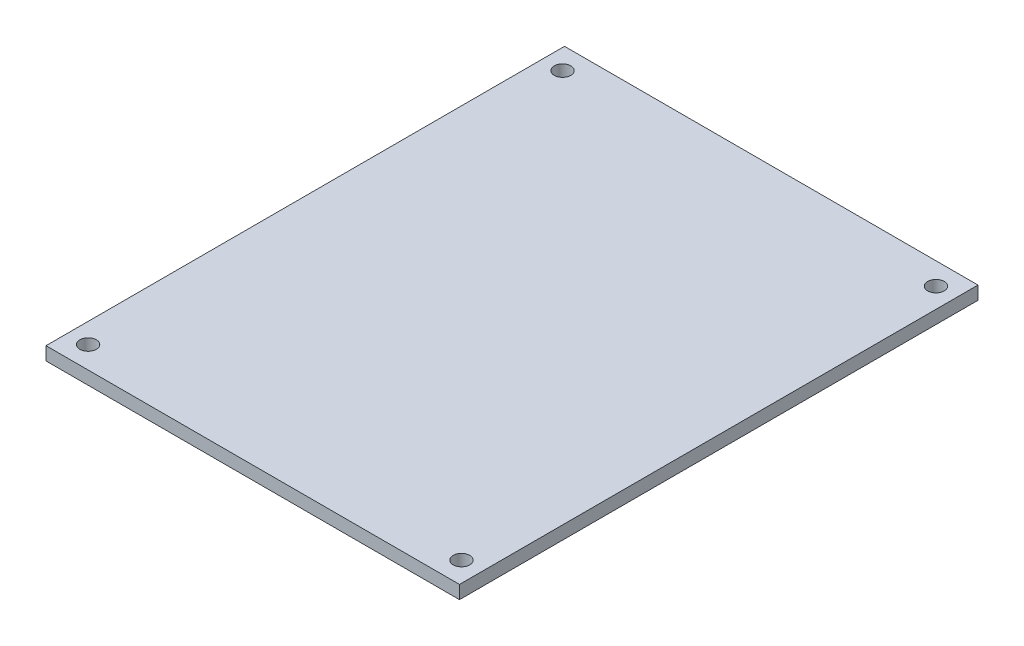
ISO-10303-21;
HEADER;
FILE_DESCRIPTION(('STEP AP214'),'2;1');
FILE_NAME('part.step','',(''),(''),'','','');
FILE_SCHEMA(('AUTOMOTIVE_DESIGN { 1 0 10303 214 1 1 1 1 }'));
ENDSEC;
DATA;
#1=APPLICATION_CONTEXT('core data for automotive mechanical design processes');
#2=APPLICATION_PROTOCOL_DEFINITION('international standard','automotive_design',2000,#1);
#3=PRODUCT_CONTEXT('',#1,'mechanical');
#4=PRODUCT('Part','Part','',(#3));
#5=PRODUCT_RELATED_PRODUCT_CATEGORY('part','',(#4));
#6=PRODUCT_DEFINITION_FORMATION('','',#4);
#7=PRODUCT_DEFINITION_CONTEXT('part definition',#1,'design');
#8=PRODUCT_DEFINITION('design','',#6,#7);
#9=PRODUCT_DEFINITION_SHAPE('','',#8);
#10=(LENGTH_UNIT() NAMED_UNIT(*) SI_UNIT(.MILLI.,.METRE.));
#11=(NAMED_UNIT(*) PLANE_ANGLE_UNIT() SI_UNIT($,.RADIAN.));
#12=(NAMED_UNIT(*) SI_UNIT($,.STERADIAN.) SOLID_ANGLE_UNIT());
#13=UNCERTAINTY_MEASURE_WITH_UNIT(LENGTH_MEASURE(1.E-05),#10,'distance_accuracy_value','');
#14=(GEOMETRIC_REPRESENTATION_CONTEXT(3) GLOBAL_UNCERTAINTY_ASSIGNED_CONTEXT((#13)) GLOBAL_UNIT_ASSIGNED_CONTEXT((#10,
#11,#12)) REPRESENTATION_CONTEXT('',''));
#15=CARTESIAN_POINT('',(0.,0.,0.));
#16=DIRECTION('',(0.,0.,1.));
#17=DIRECTION('',(1.,0.,0.));
#18=AXIS2_PLACEMENT_3D('',#15,#16,#17);
#19=CARTESIAN_POINT('',(-25.4,1.6256,31.8516));
#20=DIRECTION('',(0.,1.,0.));
#21=DIRECTION('',(0.,0.,1.));
#22=AXIS2_PLACEMENT_3D('',#19,#20,#21);
#23=PLANE('',#22);
#24=CARTESIAN_POINT('',(22.9362,1.6256,29.1465));
#25=DIRECTION('',(0.,1.,0.));
#26=DIRECTION('',(0.,0.,1.));
#27=AXIS2_PLACEMENT_3D('',#24,#25,#26);
#28=CIRCLE('',#27,1.016);
#29=CARTESIAN_POINT('',(22.9362,1.6256,30.1625));
#30=VERTEX_POINT('',#29);
#31=EDGE_CURVE('E118',#30,#30,#28,.T.);
#32=ORIENTED_EDGE('',*,*,#31,.F.);
#33=EDGE_LOOP('',(#32));
#34=FACE_BOUND('',#33,.T.);
#35=CARTESIAN_POINT('',(-22.9362,1.6256,-29.1465));
#36=DIRECTION('',(0.,1.,0.));
#37=DIRECTION('',(0.,0.,1.));
#38=AXIS2_PLACEMENT_3D('',#35,#36,#37);
#39=CIRCLE('',#38,1.016);
#40=CARTESIAN_POINT('',(-22.9362,1.6256,-28.1305));
#41=VERTEX_POINT('',#40);
#42=EDGE_CURVE('E97',#41,#41,#39,.T.);
#43=ORIENTED_EDGE('',*,*,#42,.F.);
#44=EDGE_LOOP('',(#43));
#45=FACE_BOUND('',#44,.T.);
#46=DIRECTION('',(0.,0.,1.));
#47=VECTOR('',#46,1.);
#48=CARTESIAN_POINT('',(-25.4,1.6256,-31.8516));
#49=LINE('',#48,#47);
#50=CARTESIAN_POINT('',(-25.4,1.6256,-31.8516));
#51=VERTEX_POINT('',#50);
#52=CARTESIAN_POINT('',(-25.4,1.6256,31.8516));
#53=VERTEX_POINT('',#52);
#54=EDGE_CURVE('E82',#51,#53,#49,.T.);
#55=ORIENTED_EDGE('',*,*,#54,.T.);
#56=DIRECTION('',(1.,0.,0.));
#57=VECTOR('',#56,1.);
#58=CARTESIAN_POINT('',(-25.4,1.6256,31.8516));
#59=LINE('',#58,#57);
#60=CARTESIAN_POINT('',(25.4,1.6256,31.8516));
#61=VERTEX_POINT('',#60);
#62=EDGE_CURVE('E77',#53,#61,#59,.T.);
#63=ORIENTED_EDGE('',*,*,#62,.T.);
#64=DIRECTION('',(0.,0.,-1.));
#65=VECTOR('',#64,1.);
#66=CARTESIAN_POINT('',(25.4,1.6256,-31.8516));
#67=LINE('',#66,#65);
#68=CARTESIAN_POINT('',(25.4,1.6256,-31.8516));
#69=VERTEX_POINT('',#68);
#70=EDGE_CURVE('E80',#61,#69,#67,.T.);
#71=ORIENTED_EDGE('',*,*,#70,.T.);
#72=DIRECTION('',(-1.,0.,0.));
#73=VECTOR('',#72,1.);
#74=CARTESIAN_POINT('',(-25.4,1.6256,-31.8516));
#75=LINE('',#74,#73);
#76=EDGE_CURVE('E47',#69,#51,#75,.T.);
#77=ORIENTED_EDGE('',*,*,#76,.T.);
#78=EDGE_LOOP('',(#55,#63,#71,#77));
#79=FACE_BOUND('',#78,.T.);
#80=CARTESIAN_POINT('',(22.9362,1.6256,-29.1465));
#81=DIRECTION('',(0.,1.,0.));
#82=DIRECTION('',(0.,0.,1.));
#83=AXIS2_PLACEMENT_3D('',#80,#81,#82);
#84=CIRCLE('',#83,1.016);
#85=CARTESIAN_POINT('',(22.9362,1.6256,-28.1305));
#86=VERTEX_POINT('',#85);
#87=EDGE_CURVE('E112',#86,#86,#84,.T.);
#88=ORIENTED_EDGE('',*,*,#87,.F.);
#89=EDGE_LOOP('',(#88));
#90=FACE_BOUND('',#89,.T.);
#91=CARTESIAN_POINT('',(-22.9362,1.6256,29.1465));
#92=DIRECTION('',(0.,1.,0.));
#93=DIRECTION('',(0.,0.,1.));
#94=AXIS2_PLACEMENT_3D('',#91,#92,#93);
#95=CIRCLE('',#94,1.016);
#96=CARTESIAN_POINT('',(-22.9362,1.6256,30.1625));
#97=VERTEX_POINT('',#96);
#98=EDGE_CURVE('E124',#97,#97,#95,.T.);
#99=ORIENTED_EDGE('',*,*,#98,.F.);
#100=EDGE_LOOP('',(#99));
#101=FACE_BOUND('',#100,.T.);
#102=ADVANCED_FACE('F30',(#34,#45,#79,#90,#101),#23,.T.);
#103=CARTESIAN_POINT('',(-25.4,0.,31.8516));
#104=DIRECTION('',(0.,1.,0.));
#105=DIRECTION('',(0.,0.,1.));
#106=AXIS2_PLACEMENT_3D('',#103,#104,#105);
#107=PLANE('',#106);
#108=CARTESIAN_POINT('',(22.9362,0.,29.1465));
#109=DIRECTION('',(0.,1.,0.));
#110=DIRECTION('',(0.,0.,1.));
#111=AXIS2_PLACEMENT_3D('',#108,#109,#110);
#112=CIRCLE('',#111,1.016);
#113=CARTESIAN_POINT('',(22.9362,0.,30.1625));
#114=VERTEX_POINT('',#113);
#115=EDGE_CURVE('E121',#114,#114,#112,.T.);
#116=ORIENTED_EDGE('',*,*,#115,.T.);
#117=EDGE_LOOP('',(#116));
#118=FACE_BOUND('',#117,.T.);
#119=CARTESIAN_POINT('',(-22.9362,0.,-29.1465));
#120=DIRECTION('',(0.,1.,0.));
#121=DIRECTION('',(0.,0.,1.));
#122=AXIS2_PLACEMENT_3D('',#119,#120,#121);
#123=CIRCLE('',#122,1.016);
#124=CARTESIAN_POINT('',(-22.9362,0.,-28.1305));
#125=VERTEX_POINT('',#124);
#126=EDGE_CURVE('E109',#125,#125,#123,.T.);
#127=ORIENTED_EDGE('',*,*,#126,.T.);
#128=EDGE_LOOP('',(#127));
#129=FACE_BOUND('',#128,.T.);
#130=DIRECTION('',(0.,0.,1.));
#131=VECTOR('',#130,1.);
#132=CARTESIAN_POINT('',(-25.4,0.,-31.8516));
#133=LINE('',#132,#131);
#134=CARTESIAN_POINT('',(-25.4,0.,-31.8516));
#135=VERTEX_POINT('',#134);
#136=CARTESIAN_POINT('',(-25.4,0.,31.8516));
#137=VERTEX_POINT('',#136);
#138=EDGE_CURVE('E94',#135,#137,#133,.T.);
#139=ORIENTED_EDGE('',*,*,#138,.F.);
#140=DIRECTION('',(-1.,0.,0.));
#141=VECTOR('',#140,1.);
#142=CARTESIAN_POINT('',(-25.4,0.,-31.8516));
#143=LINE('',#142,#141);
#144=CARTESIAN_POINT('',(25.4,0.,-31.8516));
#145=VERTEX_POINT('',#144);
#146=EDGE_CURVE('E70',#145,#135,#143,.T.);
#147=ORIENTED_EDGE('',*,*,#146,.F.);
#148=DIRECTION('',(0.,0.,-1.));
#149=VECTOR('',#148,1.);
#150=CARTESIAN_POINT('',(25.4,0.,-31.8516));
#151=LINE('',#150,#149);
#152=CARTESIAN_POINT('',(25.4,0.,31.8516));
#153=VERTEX_POINT('',#152);
#154=EDGE_CURVE('E64',#153,#145,#151,.T.);
#155=ORIENTED_EDGE('',*,*,#154,.F.);
#156=DIRECTION('',(1.,0.,0.));
#157=VECTOR('',#156,1.);
#158=CARTESIAN_POINT('',(-25.4,0.,31.8516));
#159=LINE('',#158,#157);
#160=EDGE_CURVE('E86',#137,#153,#159,.T.);
#161=ORIENTED_EDGE('',*,*,#160,.F.);
#162=EDGE_LOOP('',(#139,#147,#155,#161));
#163=FACE_BOUND('',#162,.T.);
#164=CARTESIAN_POINT('',(22.9362,0.,-29.1465));
#165=DIRECTION('',(0.,1.,0.));
#166=DIRECTION('',(0.,0.,1.));
#167=AXIS2_PLACEMENT_3D('',#164,#165,#166);
#168=CIRCLE('',#167,1.016);
#169=CARTESIAN_POINT('',(22.9362,0.,-28.1305));
#170=VERTEX_POINT('',#169);
#171=EDGE_CURVE('E115',#170,#170,#168,.T.);
#172=ORIENTED_EDGE('',*,*,#171,.T.);
#173=EDGE_LOOP('',(#172));
#174=FACE_BOUND('',#173,.T.);
#175=CARTESIAN_POINT('',(-22.9362,0.,29.1465));
#176=DIRECTION('',(0.,1.,0.));
#177=DIRECTION('',(0.,0.,1.));
#178=AXIS2_PLACEMENT_3D('',#175,#176,#177);
#179=CIRCLE('',#178,1.016);
#180=CARTESIAN_POINT('',(-22.9362,0.,30.1625));
#181=VERTEX_POINT('',#180);
#182=EDGE_CURVE('E127',#181,#181,#179,.T.);
#183=ORIENTED_EDGE('',*,*,#182,.T.);
#184=EDGE_LOOP('',(#183));
#185=FACE_BOUND('',#184,.T.);
#186=ADVANCED_FACE('F105',(#118,#129,#163,#174,#185),#107,.F.);
#187=CARTESIAN_POINT('',(-25.4,1.6256,-31.8516));
#188=DIRECTION('',(1.,0.,0.));
#189=DIRECTION('',(0.,0.,-1.));
#190=AXIS2_PLACEMENT_3D('',#187,#188,#189);
#191=PLANE('',#190);
#192=ORIENTED_EDGE('',*,*,#138,.T.);
#193=DIRECTION('',(0.,-1.,0.));
#194=VECTOR('',#193,1.);
#195=CARTESIAN_POINT('',(-25.4,1.6256,31.8516));
#196=LINE('',#195,#194);
#197=EDGE_CURVE('E11',#53,#137,#196,.T.);
#198=ORIENTED_EDGE('',*,*,#197,.F.);
#199=ORIENTED_EDGE('',*,*,#54,.F.);
#200=DIRECTION('',(0.,-1.,0.));
#201=VECTOR('',#200,1.);
#202=CARTESIAN_POINT('',(-25.4,1.6256,-31.8516));
#203=LINE('',#202,#201);
#204=EDGE_CURVE('E90',#51,#135,#203,.T.);
#205=ORIENTED_EDGE('',*,*,#204,.T.);
#206=EDGE_LOOP('',(#192,#198,#199,#205));
#207=FACE_BOUND('',#206,.T.);
#208=ADVANCED_FACE('F32',(#207),#191,.F.);
#209=CARTESIAN_POINT('',(-25.4,1.6256,31.8516));
#210=DIRECTION('',(0.,0.,-1.));
#211=DIRECTION('',(-1.,0.,0.));
#212=AXIS2_PLACEMENT_3D('',#209,#210,#211);
#213=PLANE('',#212);
#214=ORIENTED_EDGE('',*,*,#160,.T.);
#215=DIRECTION('',(0.,-1.,0.));
#216=VECTOR('',#215,1.);
#217=CARTESIAN_POINT('',(25.4,1.6256,31.8516));
#218=LINE('',#217,#216);
#219=EDGE_CURVE('E39',#61,#153,#218,.T.);
#220=ORIENTED_EDGE('',*,*,#219,.F.);
#221=ORIENTED_EDGE('',*,*,#62,.F.);
#222=ORIENTED_EDGE('',*,*,#197,.T.);
#223=EDGE_LOOP('',(#214,#220,#221,#222));
#224=FACE_BOUND('',#223,.T.);
#225=ADVANCED_FACE('F85',(#224),#213,.F.);
#226=CARTESIAN_POINT('',(25.4,1.6256,-31.8516));
#227=DIRECTION('',(-1.,0.,0.));
#228=DIRECTION('',(0.,0.,1.));
#229=AXIS2_PLACEMENT_3D('',#226,#227,#228);
#230=PLANE('',#229);
#231=ORIENTED_EDGE('',*,*,#154,.T.);
#232=DIRECTION('',(0.,-1.,0.));
#233=VECTOR('',#232,1.);
#234=CARTESIAN_POINT('',(25.4,1.6256,-31.8516));
#235=LINE('',#234,#233);
#236=EDGE_CURVE('E87',#69,#145,#235,.T.);
#237=ORIENTED_EDGE('',*,*,#236,.F.);
#238=ORIENTED_EDGE('',*,*,#70,.F.);
#239=ORIENTED_EDGE('',*,*,#219,.T.);
#240=EDGE_LOOP('',(#231,#237,#238,#239));
#241=FACE_BOUND('',#240,.T.);
#242=ADVANCED_FACE('F88',(#241),#230,.F.);
#243=CARTESIAN_POINT('',(-25.4,1.6256,-31.8516));
#244=DIRECTION('',(0.,0.,1.));
#245=DIRECTION('',(1.,0.,0.));
#246=AXIS2_PLACEMENT_3D('',#243,#244,#245);
#247=PLANE('',#246);
#248=ORIENTED_EDGE('',*,*,#146,.T.);
#249=ORIENTED_EDGE('',*,*,#204,.F.);
#250=ORIENTED_EDGE('',*,*,#76,.F.);
#251=ORIENTED_EDGE('',*,*,#236,.T.);
#252=EDGE_LOOP('',(#248,#249,#250,#251));
#253=FACE_BOUND('',#252,.T.);
#254=ADVANCED_FACE('F102',(#253),#247,.F.);
#255=CARTESIAN_POINT('',(-22.9362,1.6256,-29.1465));
#256=DIRECTION('',(0.,-1.,0.));
#257=DIRECTION('',(0.,0.,-1.));
#258=AXIS2_PLACEMENT_3D('',#255,#256,#257);
#259=CYLINDRICAL_SURFACE('',#258,1.016);
#260=ORIENTED_EDGE('',*,*,#42,.T.);
#261=EDGE_LOOP('',(#260));
#262=FACE_BOUND('',#261,.T.);
#263=ORIENTED_EDGE('',*,*,#126,.F.);
#264=EDGE_LOOP('',(#263));
#265=FACE_BOUND('',#264,.T.);
#266=ADVANCED_FACE('F147',(#262,#265),#259,.F.);
#267=CARTESIAN_POINT('',(22.9362,1.6256,-29.1465));
#268=DIRECTION('',(0.,-1.,0.));
#269=DIRECTION('',(0.,0.,-1.));
#270=AXIS2_PLACEMENT_3D('',#267,#268,#269);
#271=CYLINDRICAL_SURFACE('',#270,1.016);
#272=ORIENTED_EDGE('',*,*,#87,.T.);
#273=EDGE_LOOP('',(#272));
#274=FACE_BOUND('',#273,.T.);
#275=ORIENTED_EDGE('',*,*,#171,.F.);
#276=EDGE_LOOP('',(#275));
#277=FACE_BOUND('',#276,.T.);
#278=ADVANCED_FACE('F193',(#274,#277),#271,.F.);
#279=CARTESIAN_POINT('',(22.9362,1.6256,29.1465));
#280=DIRECTION('',(0.,-1.,0.));
#281=DIRECTION('',(0.,0.,-1.));
#282=AXIS2_PLACEMENT_3D('',#279,#280,#281);
#283=CYLINDRICAL_SURFACE('',#282,1.016);
#284=ORIENTED_EDGE('',*,*,#31,.T.);
#285=EDGE_LOOP('',(#284));
#286=FACE_BOUND('',#285,.T.);
#287=ORIENTED_EDGE('',*,*,#115,.F.);
#288=EDGE_LOOP('',(#287));
#289=FACE_BOUND('',#288,.T.);
#290=ADVANCED_FACE('F201',(#286,#289),#283,.F.);
#291=CARTESIAN_POINT('',(-22.9362,1.6256,29.1465));
#292=DIRECTION('',(0.,-1.,0.));
#293=DIRECTION('',(0.,0.,-1.));
#294=AXIS2_PLACEMENT_3D('',#291,#292,#293);
#295=CYLINDRICAL_SURFACE('',#294,1.016);
#296=ORIENTED_EDGE('',*,*,#98,.T.);
#297=EDGE_LOOP('',(#296));
#298=FACE_BOUND('',#297,.T.);
#299=ORIENTED_EDGE('',*,*,#182,.F.);
#300=EDGE_LOOP('',(#299));
#301=FACE_BOUND('',#300,.T.);
#302=ADVANCED_FACE('F133',(#298,#301),#295,.F.);
#303=CLOSED_SHELL('',(#102,#186,#208,#225,#242,#254,#266,#278,#290,#302));
#304=MANIFOLD_SOLID_BREP('B2',#303);
#305=ADVANCED_BREP_SHAPE_REPRESENTATION('',(#18,#304),#14);
#306=SHAPE_DEFINITION_REPRESENTATION(#9,#305);
ENDSEC;
END-ISO-10303-21;
